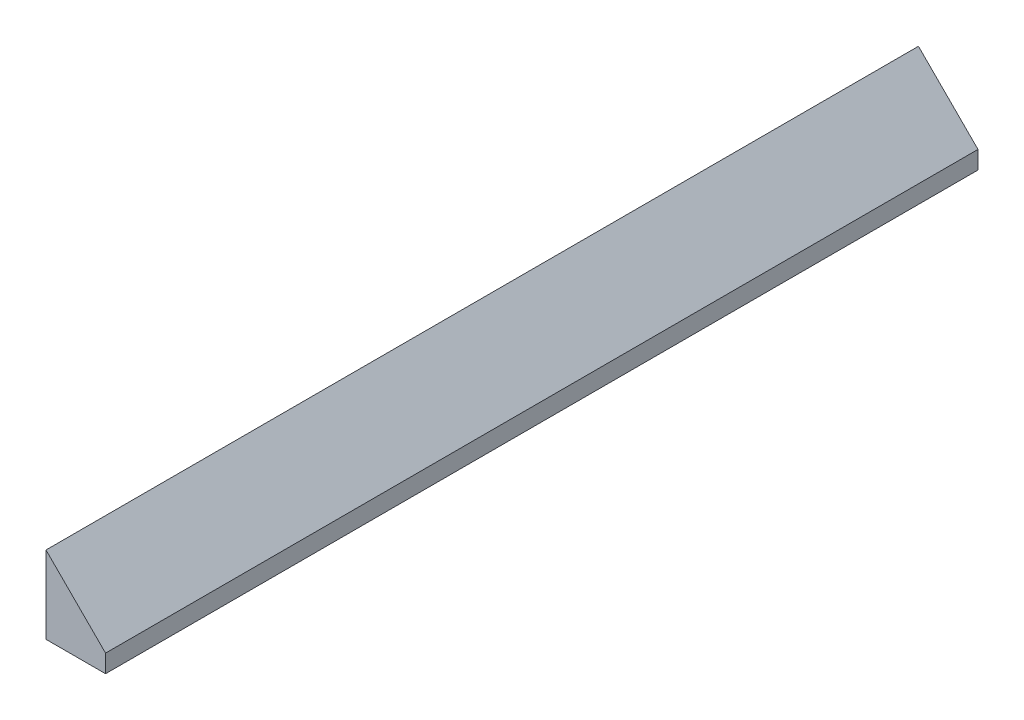
ISO-10303-21;
HEADER;
FILE_DESCRIPTION(('STEP AP214'),'2;1');
FILE_NAME('part.step','',(''),(''),'','','');
FILE_SCHEMA(('AUTOMOTIVE_DESIGN { 1 0 10303 214 1 1 1 1 }'));
ENDSEC;
DATA;
#1=APPLICATION_CONTEXT('core data for automotive mechanical design processes');
#2=APPLICATION_PROTOCOL_DEFINITION('international standard','automotive_design',2000,#1);
#3=PRODUCT_CONTEXT('',#1,'mechanical');
#4=PRODUCT('Part','Part','',(#3));
#5=PRODUCT_RELATED_PRODUCT_CATEGORY('part','',(#4));
#6=PRODUCT_DEFINITION_FORMATION('','',#4);
#7=PRODUCT_DEFINITION_CONTEXT('part definition',#1,'design');
#8=PRODUCT_DEFINITION('design','',#6,#7);
#9=PRODUCT_DEFINITION_SHAPE('','',#8);
#10=(LENGTH_UNIT() NAMED_UNIT(*) SI_UNIT(.MILLI.,.METRE.));
#11=(NAMED_UNIT(*) PLANE_ANGLE_UNIT() SI_UNIT($,.RADIAN.));
#12=(NAMED_UNIT(*) SI_UNIT($,.STERADIAN.) SOLID_ANGLE_UNIT());
#13=UNCERTAINTY_MEASURE_WITH_UNIT(LENGTH_MEASURE(1.E-05),#10,'distance_accuracy_value','');
#14=(GEOMETRIC_REPRESENTATION_CONTEXT(3) GLOBAL_UNCERTAINTY_ASSIGNED_CONTEXT((#13)) GLOBAL_UNIT_ASSIGNED_CONTEXT((#10,
#11,#12)) REPRESENTATION_CONTEXT('',''));
#15=CARTESIAN_POINT('',(0.,0.,0.));
#16=DIRECTION('',(0.,0.,1.));
#17=DIRECTION('',(1.,0.,0.));
#18=AXIS2_PLACEMENT_3D('',#15,#16,#17);
#19=CARTESIAN_POINT('',(0.,0.,-14.65));
#20=DIRECTION('',(0.,-1.,0.));
#21=DIRECTION('',(0.,0.,-1.));
#22=AXIS2_PLACEMENT_3D('',#19,#20,#21);
#23=PLANE('',#22);
#24=DIRECTION('',(1.,0.,0.));
#25=VECTOR('',#24,1.);
#26=CARTESIAN_POINT('',(0.,0.,14.65));
#27=LINE('',#26,#25);
#28=CARTESIAN_POINT('',(0.,0.,14.65));
#29=VERTEX_POINT('',#28);
#30=CARTESIAN_POINT('',(2.00000000000003,0.,14.65));
#31=VERTEX_POINT('',#30);
#32=EDGE_CURVE('E99',#29,#31,#27,.T.);
#33=ORIENTED_EDGE('',*,*,#32,.F.);
#34=DIRECTION('',(0.,0.,1.));
#35=VECTOR('',#34,1.);
#36=CARTESIAN_POINT('',(0.,0.,-14.65));
#37=LINE('',#36,#35);
#38=CARTESIAN_POINT('',(0.,0.,-14.65));
#39=VERTEX_POINT('',#38);
#40=EDGE_CURVE('E11',#39,#29,#37,.T.);
#41=ORIENTED_EDGE('',*,*,#40,.F.);
#42=DIRECTION('',(1.,0.,0.));
#43=VECTOR('',#42,1.);
#44=CARTESIAN_POINT('',(0.,0.,-14.65));
#45=LINE('',#44,#43);
#46=CARTESIAN_POINT('',(2.00000000000003,0.,-14.65));
#47=VERTEX_POINT('',#46);
#48=EDGE_CURVE('E93',#39,#47,#45,.T.);
#49=ORIENTED_EDGE('',*,*,#48,.T.);
#50=DIRECTION('',(0.,0.,1.));
#51=VECTOR('',#50,1.);
#52=CARTESIAN_POINT('',(2.00000000000003,0.,-14.65));
#53=LINE('',#52,#51);
#54=EDGE_CURVE('E38',#47,#31,#53,.T.);
#55=ORIENTED_EDGE('',*,*,#54,.T.);
#56=EDGE_LOOP('',(#33,#41,#49,#55));
#57=FACE_BOUND('',#56,.T.);
#58=ADVANCED_FACE('F35',(#57),#23,.T.);
#59=CARTESIAN_POINT('',(0.,0.,-14.65));
#60=DIRECTION('',(-1.,0.,0.));
#61=DIRECTION('',(0.,0.,1.));
#62=AXIS2_PLACEMENT_3D('',#59,#60,#61);
#63=PLANE('',#62);
#64=DIRECTION('',(0.,-1.,0.));
#65=VECTOR('',#64,1.);
#66=CARTESIAN_POINT('',(0.,0.,14.65));
#67=LINE('',#66,#65);
#68=CARTESIAN_POINT('',(0.,2.60000000000002,14.65));
#69=VERTEX_POINT('',#68);
#70=EDGE_CURVE('E95',#69,#29,#67,.T.);
#71=ORIENTED_EDGE('',*,*,#70,.F.);
#72=DIRECTION('',(0.,0.,1.));
#73=VECTOR('',#72,1.);
#74=CARTESIAN_POINT('',(0.,2.60000000000002,-14.65));
#75=LINE('',#74,#73);
#76=CARTESIAN_POINT('',(0.,2.60000000000002,-14.65));
#77=VERTEX_POINT('',#76);
#78=EDGE_CURVE('E44',#77,#69,#75,.T.);
#79=ORIENTED_EDGE('',*,*,#78,.F.);
#80=DIRECTION('',(0.,-1.,0.));
#81=VECTOR('',#80,1.);
#82=CARTESIAN_POINT('',(0.,0.,-14.65));
#83=LINE('',#82,#81);
#84=EDGE_CURVE('E90',#77,#39,#83,.T.);
#85=ORIENTED_EDGE('',*,*,#84,.T.);
#86=ORIENTED_EDGE('',*,*,#40,.T.);
#87=EDGE_LOOP('',(#71,#79,#85,#86));
#88=FACE_BOUND('',#87,.T.);
#89=ADVANCED_FACE('F109',(#88),#63,.T.);
#90=CARTESIAN_POINT('',(1.30000000000001,1.30000000000001,-14.65));
#91=DIRECTION('',(0.707106781186548,0.707106781186547,0.));
#92=DIRECTION('',(-0.707106781186547,0.707106781186548,0.));
#93=AXIS2_PLACEMENT_3D('',#90,#91,#92);
#94=PLANE('',#93);
#95=DIRECTION('',(-0.707106781186547,0.707106781186548,0.));
#96=VECTOR('',#95,1.);
#97=CARTESIAN_POINT('',(1.30000000000001,1.30000000000001,14.65));
#98=LINE('',#97,#96);
#99=CARTESIAN_POINT('',(2.00000000000003,0.59999999999999,14.65));
#100=VERTEX_POINT('',#99);
#101=EDGE_CURVE('E85',#100,#69,#98,.T.);
#102=ORIENTED_EDGE('',*,*,#101,.F.);
#103=DIRECTION('',(0.,0.,1.));
#104=VECTOR('',#103,1.);
#105=CARTESIAN_POINT('',(2.00000000000003,0.59999999999999,-14.65));
#106=LINE('',#105,#104);
#107=CARTESIAN_POINT('',(2.00000000000003,0.59999999999999,-14.65));
#108=VERTEX_POINT('',#107);
#109=EDGE_CURVE('E80',#108,#100,#106,.T.);
#110=ORIENTED_EDGE('',*,*,#109,.F.);
#111=DIRECTION('',(-0.707106781186547,0.707106781186548,0.));
#112=VECTOR('',#111,1.);
#113=CARTESIAN_POINT('',(1.30000000000001,1.30000000000001,-14.65));
#114=LINE('',#113,#112);
#115=EDGE_CURVE('E83',#108,#77,#114,.T.);
#116=ORIENTED_EDGE('',*,*,#115,.T.);
#117=ORIENTED_EDGE('',*,*,#78,.T.);
#118=EDGE_LOOP('',(#102,#110,#116,#117));
#119=FACE_BOUND('',#118,.T.);
#120=ADVANCED_FACE('F82',(#119),#94,.T.);
#121=CARTESIAN_POINT('',(2.00000000000003,0.,-14.65));
#122=DIRECTION('',(1.,0.,0.));
#123=DIRECTION('',(0.,0.,-1.));
#124=AXIS2_PLACEMENT_3D('',#121,#122,#123);
#125=PLANE('',#124);
#126=DIRECTION('',(0.,1.,0.));
#127=VECTOR('',#126,1.);
#128=CARTESIAN_POINT('',(2.00000000000003,0.,14.65));
#129=LINE('',#128,#127);
#130=EDGE_CURVE('E102',#31,#100,#129,.T.);
#131=ORIENTED_EDGE('',*,*,#130,.F.);
#132=ORIENTED_EDGE('',*,*,#54,.F.);
#133=DIRECTION('',(0.,1.,0.));
#134=VECTOR('',#133,1.);
#135=CARTESIAN_POINT('',(2.00000000000003,0.,-14.65));
#136=LINE('',#135,#134);
#137=EDGE_CURVE('E89',#47,#108,#136,.T.);
#138=ORIENTED_EDGE('',*,*,#137,.T.);
#139=ORIENTED_EDGE('',*,*,#109,.T.);
#140=EDGE_LOOP('',(#131,#132,#138,#139));
#141=FACE_BOUND('',#140,.T.);
#142=ADVANCED_FACE('F92',(#141),#125,.T.);
#143=CARTESIAN_POINT('',(0.,0.,-14.65));
#144=DIRECTION('',(0.,0.,1.));
#145=DIRECTION('',(1.,0.,0.));
#146=AXIS2_PLACEMENT_3D('',#143,#144,#145);
#147=PLANE('',#146);
#148=ORIENTED_EDGE('',*,*,#48,.F.);
#149=ORIENTED_EDGE('',*,*,#84,.F.);
#150=ORIENTED_EDGE('',*,*,#115,.F.);
#151=ORIENTED_EDGE('',*,*,#137,.F.);
#152=EDGE_LOOP('',(#148,#149,#150,#151));
#153=FACE_BOUND('',#152,.T.);
#154=ADVANCED_FACE('F88',(#153),#147,.F.);
#155=CARTESIAN_POINT('',(0.,0.,14.65));
#156=DIRECTION('',(0.,0.,1.));
#157=DIRECTION('',(1.,0.,0.));
#158=AXIS2_PLACEMENT_3D('',#155,#156,#157);
#159=PLANE('',#158);
#160=ORIENTED_EDGE('',*,*,#32,.T.);
#161=ORIENTED_EDGE('',*,*,#130,.T.);
#162=ORIENTED_EDGE('',*,*,#101,.T.);
#163=ORIENTED_EDGE('',*,*,#70,.T.);
#164=EDGE_LOOP('',(#160,#161,#162,#163));
#165=FACE_BOUND('',#164,.T.);
#166=ADVANCED_FACE('F108',(#165),#159,.T.);
#167=CLOSED_SHELL('',(#58,#89,#120,#142,#154,#166));
#168=MANIFOLD_SOLID_BREP('B2',#167);
#169=ADVANCED_BREP_SHAPE_REPRESENTATION('',(#18,#168),#14);
#170=SHAPE_DEFINITION_REPRESENTATION(#9,#169);
ENDSEC;
END-ISO-10303-21;
